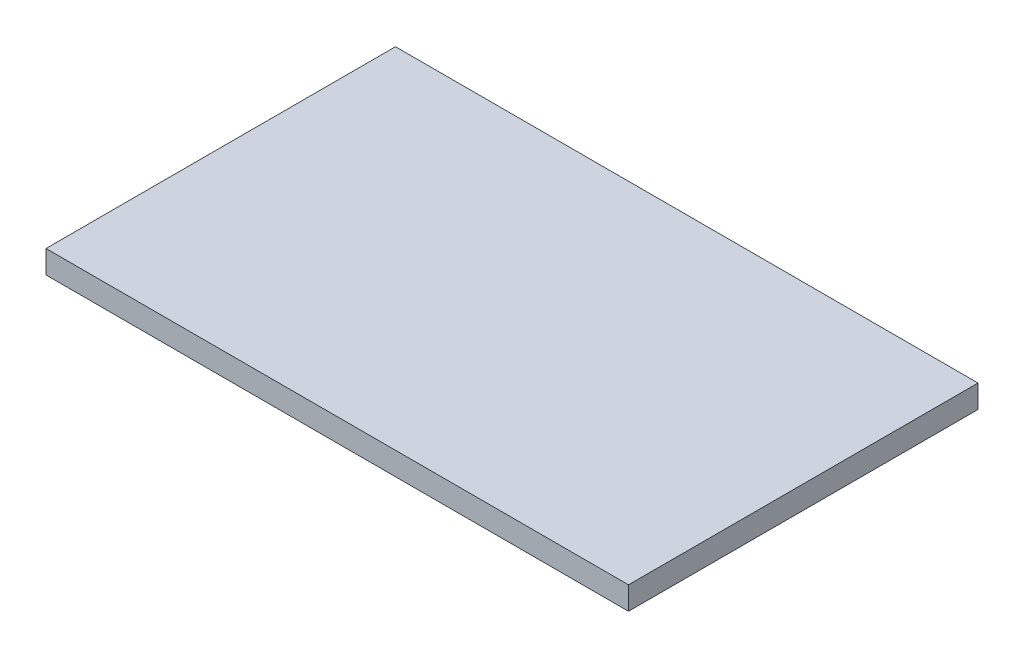
ISO-10303-21;
HEADER;
FILE_DESCRIPTION(('STEP AP214'),'2;1');
FILE_NAME('part.step','',(''),(''),'','','');
FILE_SCHEMA(('AUTOMOTIVE_DESIGN { 1 0 10303 214 1 1 1 1 }'));
ENDSEC;
DATA;
#1=APPLICATION_CONTEXT('core data for automotive mechanical design processes');
#2=APPLICATION_PROTOCOL_DEFINITION('international standard','automotive_design',2000,#1);
#3=PRODUCT_CONTEXT('',#1,'mechanical');
#4=PRODUCT('Part','Part','',(#3));
#5=PRODUCT_RELATED_PRODUCT_CATEGORY('part','',(#4));
#6=PRODUCT_DEFINITION_FORMATION('','',#4);
#7=PRODUCT_DEFINITION_CONTEXT('part definition',#1,'design');
#8=PRODUCT_DEFINITION('design','',#6,#7);
#9=PRODUCT_DEFINITION_SHAPE('','',#8);
#10=(LENGTH_UNIT() NAMED_UNIT(*) SI_UNIT(.MILLI.,.METRE.));
#11=(NAMED_UNIT(*) PLANE_ANGLE_UNIT() SI_UNIT($,.RADIAN.));
#12=(NAMED_UNIT(*) SI_UNIT($,.STERADIAN.) SOLID_ANGLE_UNIT());
#13=UNCERTAINTY_MEASURE_WITH_UNIT(LENGTH_MEASURE(1.E-05),#10,'distance_accuracy_value','');
#14=(GEOMETRIC_REPRESENTATION_CONTEXT(3) GLOBAL_UNCERTAINTY_ASSIGNED_CONTEXT((#13)) GLOBAL_UNIT_ASSIGNED_CONTEXT((#10,
#11,#12)) REPRESENTATION_CONTEXT('',''));
#15=CARTESIAN_POINT('',(0.,0.,0.));
#16=DIRECTION('',(0.,0.,1.));
#17=DIRECTION('',(1.,0.,0.));
#18=AXIS2_PLACEMENT_3D('',#15,#16,#17);
#19=CARTESIAN_POINT('',(254.,-20.,152.4));
#20=DIRECTION('',(1.,0.,0.));
#21=DIRECTION('',(0.,0.,-1.));
#22=AXIS2_PLACEMENT_3D('',#19,#20,#21);
#23=PLANE('',#22);
#24=DIRECTION('',(0.,0.,-1.));
#25=VECTOR('',#24,1.);
#26=CARTESIAN_POINT('',(254.,0.,152.4));
#27=LINE('',#26,#25);
#28=CARTESIAN_POINT('',(254.,0.,152.4));
#29=VERTEX_POINT('',#28);
#30=CARTESIAN_POINT('',(254.,0.,-152.4));
#31=VERTEX_POINT('',#30);
#32=EDGE_CURVE('E97',#29,#31,#27,.T.);
#33=ORIENTED_EDGE('',*,*,#32,.F.);
#34=DIRECTION('',(0.,1.,0.));
#35=VECTOR('',#34,1.);
#36=CARTESIAN_POINT('',(254.,-20.,152.4));
#37=LINE('',#36,#35);
#38=CARTESIAN_POINT('',(254.,-20.,152.4));
#39=VERTEX_POINT('',#38);
#40=EDGE_CURVE('E11',#39,#29,#37,.T.);
#41=ORIENTED_EDGE('',*,*,#40,.F.);
#42=DIRECTION('',(0.,0.,-1.));
#43=VECTOR('',#42,1.);
#44=CARTESIAN_POINT('',(254.,-20.,152.4));
#45=LINE('',#44,#43);
#46=CARTESIAN_POINT('',(254.,-20.,-152.4));
#47=VERTEX_POINT('',#46);
#48=EDGE_CURVE('E91',#39,#47,#45,.T.);
#49=ORIENTED_EDGE('',*,*,#48,.T.);
#50=DIRECTION('',(0.,1.,0.));
#51=VECTOR('',#50,1.);
#52=CARTESIAN_POINT('',(254.,-20.,-152.4));
#53=LINE('',#52,#51);
#54=EDGE_CURVE('E36',#47,#31,#53,.T.);
#55=ORIENTED_EDGE('',*,*,#54,.T.);
#56=EDGE_LOOP('',(#33,#41,#49,#55));
#57=FACE_BOUND('',#56,.T.);
#58=ADVANCED_FACE('F33',(#57),#23,.T.);
#59=CARTESIAN_POINT('',(-254.,-20.,152.4));
#60=DIRECTION('',(0.,0.,1.));
#61=DIRECTION('',(1.,0.,0.));
#62=AXIS2_PLACEMENT_3D('',#59,#60,#61);
#63=PLANE('',#62);
#64=DIRECTION('',(1.,0.,0.));
#65=VECTOR('',#64,1.);
#66=CARTESIAN_POINT('',(-254.,0.,152.4));
#67=LINE('',#66,#65);
#68=CARTESIAN_POINT('',(-254.,0.,152.4));
#69=VERTEX_POINT('',#68);
#70=EDGE_CURVE('E93',#69,#29,#67,.T.);
#71=ORIENTED_EDGE('',*,*,#70,.F.);
#72=DIRECTION('',(0.,1.,0.));
#73=VECTOR('',#72,1.);
#74=CARTESIAN_POINT('',(-254.,-20.,152.4));
#75=LINE('',#74,#73);
#76=CARTESIAN_POINT('',(-254.,-20.,152.4));
#77=VERTEX_POINT('',#76);
#78=EDGE_CURVE('E42',#77,#69,#75,.T.);
#79=ORIENTED_EDGE('',*,*,#78,.F.);
#80=DIRECTION('',(1.,0.,0.));
#81=VECTOR('',#80,1.);
#82=CARTESIAN_POINT('',(-254.,-20.,152.4));
#83=LINE('',#82,#81);
#84=EDGE_CURVE('E88',#77,#39,#83,.T.);
#85=ORIENTED_EDGE('',*,*,#84,.T.);
#86=ORIENTED_EDGE('',*,*,#40,.T.);
#87=EDGE_LOOP('',(#71,#79,#85,#86));
#88=FACE_BOUND('',#87,.T.);
#89=ADVANCED_FACE('F107',(#88),#63,.T.);
#90=CARTESIAN_POINT('',(-254.,-20.,152.4));
#91=DIRECTION('',(-1.,0.,0.));
#92=DIRECTION('',(0.,0.,1.));
#93=AXIS2_PLACEMENT_3D('',#90,#91,#92);
#94=PLANE('',#93);
#95=DIRECTION('',(0.,0.,1.));
#96=VECTOR('',#95,1.);
#97=CARTESIAN_POINT('',(-254.,0.,152.4));
#98=LINE('',#97,#96);
#99=CARTESIAN_POINT('',(-254.,0.,-152.4));
#100=VERTEX_POINT('',#99);
#101=EDGE_CURVE('E83',#100,#69,#98,.T.);
#102=ORIENTED_EDGE('',*,*,#101,.F.);
#103=DIRECTION('',(0.,1.,0.));
#104=VECTOR('',#103,1.);
#105=CARTESIAN_POINT('',(-254.,-20.,-152.4));
#106=LINE('',#105,#104);
#107=CARTESIAN_POINT('',(-254.,-20.,-152.4));
#108=VERTEX_POINT('',#107);
#109=EDGE_CURVE('E78',#108,#100,#106,.T.);
#110=ORIENTED_EDGE('',*,*,#109,.F.);
#111=DIRECTION('',(0.,0.,1.));
#112=VECTOR('',#111,1.);
#113=CARTESIAN_POINT('',(-254.,-20.,152.4));
#114=LINE('',#113,#112);
#115=EDGE_CURVE('E81',#108,#77,#114,.T.);
#116=ORIENTED_EDGE('',*,*,#115,.T.);
#117=ORIENTED_EDGE('',*,*,#78,.T.);
#118=EDGE_LOOP('',(#102,#110,#116,#117));
#119=FACE_BOUND('',#118,.T.);
#120=ADVANCED_FACE('F80',(#119),#94,.T.);
#121=CARTESIAN_POINT('',(-254.,-20.,-152.4));
#122=DIRECTION('',(0.,0.,-1.));
#123=DIRECTION('',(-1.,0.,0.));
#124=AXIS2_PLACEMENT_3D('',#121,#122,#123);
#125=PLANE('',#124);
#126=DIRECTION('',(-1.,0.,0.));
#127=VECTOR('',#126,1.);
#128=CARTESIAN_POINT('',(-254.,0.,-152.4));
#129=LINE('',#128,#127);
#130=EDGE_CURVE('E100',#31,#100,#129,.T.);
#131=ORIENTED_EDGE('',*,*,#130,.F.);
#132=ORIENTED_EDGE('',*,*,#54,.F.);
#133=DIRECTION('',(-1.,0.,0.));
#134=VECTOR('',#133,1.);
#135=CARTESIAN_POINT('',(-254.,-20.,-152.4));
#136=LINE('',#135,#134);
#137=EDGE_CURVE('E87',#47,#108,#136,.T.);
#138=ORIENTED_EDGE('',*,*,#137,.T.);
#139=ORIENTED_EDGE('',*,*,#109,.T.);
#140=EDGE_LOOP('',(#131,#132,#138,#139));
#141=FACE_BOUND('',#140,.T.);
#142=ADVANCED_FACE('F90',(#141),#125,.T.);
#143=CARTESIAN_POINT('',(0.,-20.,0.));
#144=DIRECTION('',(0.,-1.,0.));
#145=DIRECTION('',(0.,0.,-1.));
#146=AXIS2_PLACEMENT_3D('',#143,#144,#145);
#147=PLANE('',#146);
#148=ORIENTED_EDGE('',*,*,#48,.F.);
#149=ORIENTED_EDGE('',*,*,#84,.F.);
#150=ORIENTED_EDGE('',*,*,#115,.F.);
#151=ORIENTED_EDGE('',*,*,#137,.F.);
#152=EDGE_LOOP('',(#148,#149,#150,#151));
#153=FACE_BOUND('',#152,.T.);
#154=ADVANCED_FACE('F86',(#153),#147,.T.);
#155=CARTESIAN_POINT('',(0.,0.,0.));
#156=DIRECTION('',(0.,-1.,0.));
#157=DIRECTION('',(0.,0.,-1.));
#158=AXIS2_PLACEMENT_3D('',#155,#156,#157);
#159=PLANE('',#158);
#160=ORIENTED_EDGE('',*,*,#32,.T.);
#161=ORIENTED_EDGE('',*,*,#130,.T.);
#162=ORIENTED_EDGE('',*,*,#101,.T.);
#163=ORIENTED_EDGE('',*,*,#70,.T.);
#164=EDGE_LOOP('',(#160,#161,#162,#163));
#165=FACE_BOUND('',#164,.T.);
#166=ADVANCED_FACE('F106',(#165),#159,.F.);
#167=CLOSED_SHELL('',(#58,#89,#120,#142,#154,#166));
#168=MANIFOLD_SOLID_BREP('B2',#167);
#169=ADVANCED_BREP_SHAPE_REPRESENTATION('',(#18,#168),#14);
#170=SHAPE_DEFINITION_REPRESENTATION(#9,#169);
ENDSEC;
END-ISO-10303-21;
